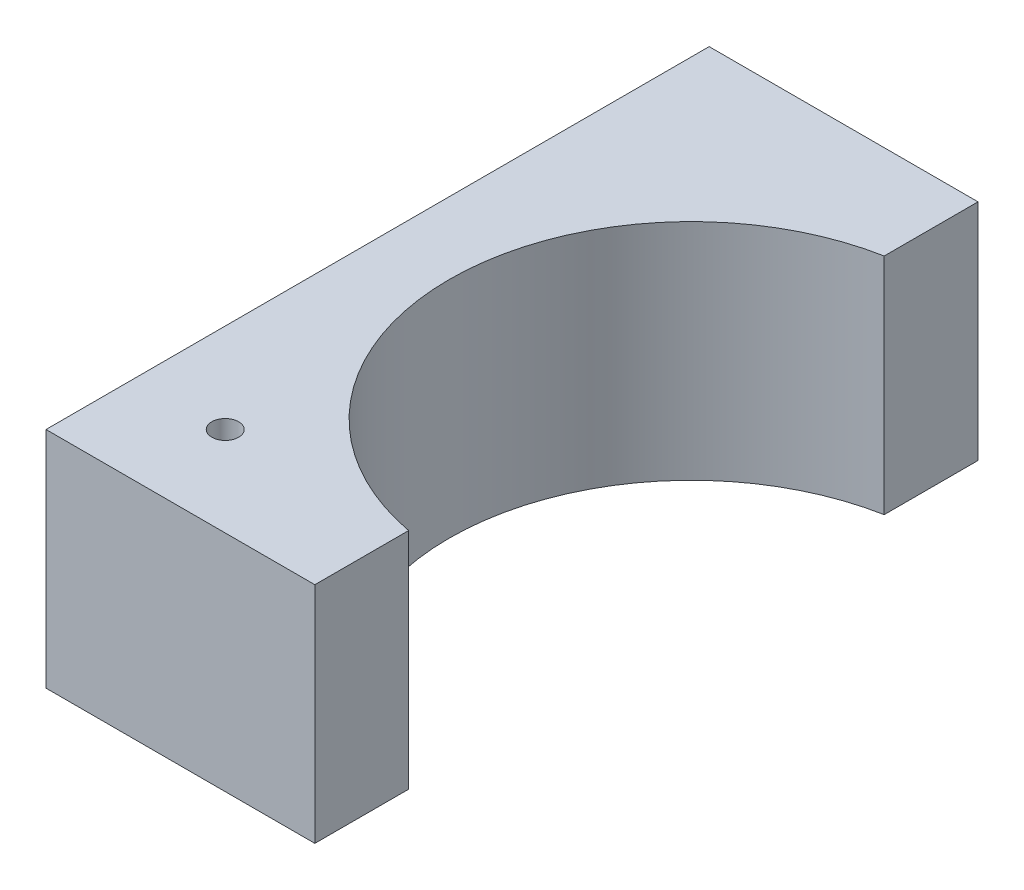
ISO-10303-21;
HEADER;
FILE_DESCRIPTION(('STEP AP214'),'2;1');
FILE_NAME('part.step','',(''),(''),'','','');
FILE_SCHEMA(('AUTOMOTIVE_DESIGN { 1 0 10303 214 1 1 1 1 }'));
ENDSEC;
DATA;
#1=APPLICATION_CONTEXT('core data for automotive mechanical design processes');
#2=APPLICATION_PROTOCOL_DEFINITION('international standard','automotive_design',2000,#1);
#3=PRODUCT_CONTEXT('',#1,'mechanical');
#4=PRODUCT('Part','Part','',(#3));
#5=PRODUCT_RELATED_PRODUCT_CATEGORY('part','',(#4));
#6=PRODUCT_DEFINITION_FORMATION('','',#4);
#7=PRODUCT_DEFINITION_CONTEXT('part definition',#1,'design');
#8=PRODUCT_DEFINITION('design','',#6,#7);
#9=PRODUCT_DEFINITION_SHAPE('','',#8);
#10=(LENGTH_UNIT() NAMED_UNIT(*) SI_UNIT(.MILLI.,.METRE.));
#11=(NAMED_UNIT(*) PLANE_ANGLE_UNIT() SI_UNIT($,.RADIAN.));
#12=(NAMED_UNIT(*) SI_UNIT($,.STERADIAN.) SOLID_ANGLE_UNIT());
#13=UNCERTAINTY_MEASURE_WITH_UNIT(LENGTH_MEASURE(1.E-05),#10,'distance_accuracy_value','');
#14=(GEOMETRIC_REPRESENTATION_CONTEXT(3) GLOBAL_UNCERTAINTY_ASSIGNED_CONTEXT((#13)) GLOBAL_UNIT_ASSIGNED_CONTEXT((#10,
#11,#12)) REPRESENTATION_CONTEXT('',''));
#15=CARTESIAN_POINT('',(0.,0.,0.));
#16=DIRECTION('',(0.,0.,1.));
#17=DIRECTION('',(1.,0.,0.));
#18=AXIS2_PLACEMENT_3D('',#15,#16,#17);
#19=CARTESIAN_POINT('',(70.,50.,-74.));
#20=DIRECTION('',(0.,1.,0.));
#21=DIRECTION('',(0.,0.,1.));
#22=AXIS2_PLACEMENT_3D('',#19,#20,#21);
#23=PLANE('',#22);
#24=DIRECTION('',(0.,0.,1.));
#25=VECTOR('',#24,1.);
#26=CARTESIAN_POINT('',(60.,50.,-148.));
#27=LINE('',#26,#25);
#28=CARTESIAN_POINT('',(60.,50.,-148.));
#29=VERTEX_POINT('',#28);
#30=CARTESIAN_POINT('',(60.,50.,-127.065996645686));
#31=VERTEX_POINT('',#30);
#32=EDGE_CURVE('E103',#29,#31,#27,.T.);
#33=ORIENTED_EDGE('',*,*,#32,.F.);
#34=DIRECTION('',(-1.,0.,0.));
#35=VECTOR('',#34,1.);
#36=CARTESIAN_POINT('',(0.,50.,-148.));
#37=LINE('',#36,#35);
#38=CARTESIAN_POINT('',(0.,50.,-148.));
#39=VERTEX_POINT('',#38);
#40=EDGE_CURVE('E121',#29,#39,#37,.T.);
#41=ORIENTED_EDGE('',*,*,#40,.T.);
#42=DIRECTION('',(0.,0.,1.));
#43=VECTOR('',#42,1.);
#44=CARTESIAN_POINT('',(0.,50.,0.));
#45=LINE('',#44,#43);
#46=CARTESIAN_POINT('',(0.,50.,0.));
#47=VERTEX_POINT('',#46);
#48=EDGE_CURVE('E115',#39,#47,#45,.T.);
#49=ORIENTED_EDGE('',*,*,#48,.T.);
#50=DIRECTION('',(1.,0.,0.));
#51=VECTOR('',#50,1.);
#52=CARTESIAN_POINT('',(70.,50.,0.));
#53=LINE('',#52,#51);
#54=CARTESIAN_POINT('',(60.,50.,0.));
#55=VERTEX_POINT('',#54);
#56=EDGE_CURVE('E120',#47,#55,#53,.T.);
#57=ORIENTED_EDGE('',*,*,#56,.T.);
#58=CARTESIAN_POINT('',(60.,50.,-20.9340033543136));
#59=VERTEX_POINT('',#58);
#60=EDGE_CURVE('E86',#59,#55,#27,.T.);
#61=ORIENTED_EDGE('',*,*,#60,.F.);
#62=CARTESIAN_POINT('',(70.,50.,-74.));
#63=DIRECTION('',(0.,-1.,0.));
#64=DIRECTION('',(0.,0.,1.));
#65=AXIS2_PLACEMENT_3D('',#62,#63,#64);
#66=CIRCLE('',#65,54.);
#67=EDGE_CURVE('E124',#59,#31,#66,.T.);
#68=ORIENTED_EDGE('',*,*,#67,.T.);
#69=EDGE_LOOP('',(#33,#41,#49,#57,#61,#68));
#70=FACE_BOUND('',#69,.T.);
#71=CARTESIAN_POINT('',(20.,50.,-20.));
#72=DIRECTION('',(0.,1.,0.));
#73=DIRECTION('',(0.,0.,1.));
#74=AXIS2_PLACEMENT_3D('',#71,#72,#73);
#75=CIRCLE('',#74,3.);
#76=CARTESIAN_POINT('',(20.,50.,-17.));
#77=VERTEX_POINT('',#76);
#78=EDGE_CURVE('E107',#77,#77,#75,.T.);
#79=ORIENTED_EDGE('',*,*,#78,.F.);
#80=EDGE_LOOP('',(#79));
#81=FACE_BOUND('',#80,.T.);
#82=ADVANCED_FACE('F32',(#70,#81),#23,.T.);
#83=CARTESIAN_POINT('',(70.,0.,-74.));
#84=DIRECTION('',(0.,1.,0.));
#85=DIRECTION('',(0.,0.,1.));
#86=AXIS2_PLACEMENT_3D('',#83,#84,#85);
#87=PLANE('',#86);
#88=DIRECTION('',(-1.,0.,0.));
#89=VECTOR('',#88,1.);
#90=CARTESIAN_POINT('',(0.,0.,-148.));
#91=LINE('',#90,#89);
#92=CARTESIAN_POINT('',(60.,0.,-148.));
#93=VERTEX_POINT('',#92);
#94=CARTESIAN_POINT('',(0.,0.,-148.));
#95=VERTEX_POINT('',#94);
#96=EDGE_CURVE('E109',#93,#95,#91,.T.);
#97=ORIENTED_EDGE('',*,*,#96,.F.);
#98=DIRECTION('',(0.,0.,1.));
#99=VECTOR('',#98,1.);
#100=CARTESIAN_POINT('',(60.,0.,-148.));
#101=LINE('',#100,#99);
#102=CARTESIAN_POINT('',(60.,0.,-127.065996645686));
#103=VERTEX_POINT('',#102);
#104=EDGE_CURVE('E55',#93,#103,#101,.T.);
#105=ORIENTED_EDGE('',*,*,#104,.T.);
#106=CARTESIAN_POINT('',(70.,0.,-74.));
#107=DIRECTION('',(0.,-1.,0.));
#108=DIRECTION('',(0.,0.,1.));
#109=AXIS2_PLACEMENT_3D('',#106,#107,#108);
#110=CIRCLE('',#109,54.);
#111=CARTESIAN_POINT('',(60.,0.,-20.9340033543136));
#112=VERTEX_POINT('',#111);
#113=EDGE_CURVE('E102',#112,#103,#110,.T.);
#114=ORIENTED_EDGE('',*,*,#113,.F.);
#115=CARTESIAN_POINT('',(60.,0.,0.));
#116=VERTEX_POINT('',#115);
#117=EDGE_CURVE('E47',#112,#116,#101,.T.);
#118=ORIENTED_EDGE('',*,*,#117,.T.);
#119=DIRECTION('',(1.,0.,0.));
#120=VECTOR('',#119,1.);
#121=CARTESIAN_POINT('',(70.,0.,0.));
#122=LINE('',#121,#120);
#123=CARTESIAN_POINT('',(0.,0.,0.));
#124=VERTEX_POINT('',#123);
#125=EDGE_CURVE('E100',#124,#116,#122,.T.);
#126=ORIENTED_EDGE('',*,*,#125,.F.);
#127=DIRECTION('',(0.,0.,1.));
#128=VECTOR('',#127,1.);
#129=CARTESIAN_POINT('',(0.,0.,0.));
#130=LINE('',#129,#128);
#131=EDGE_CURVE('E119',#95,#124,#130,.T.);
#132=ORIENTED_EDGE('',*,*,#131,.F.);
#133=EDGE_LOOP('',(#97,#105,#114,#118,#126,#132));
#134=FACE_BOUND('',#133,.T.);
#135=CARTESIAN_POINT('',(20.,0.,-20.));
#136=DIRECTION('',(0.,1.,0.));
#137=DIRECTION('',(0.,0.,1.));
#138=AXIS2_PLACEMENT_3D('',#135,#136,#137);
#139=CIRCLE('',#138,3.);
#140=CARTESIAN_POINT('',(20.,0.,-17.));
#141=VERTEX_POINT('',#140);
#142=EDGE_CURVE('E112',#141,#141,#139,.T.);
#143=ORIENTED_EDGE('',*,*,#142,.T.);
#144=EDGE_LOOP('',(#143));
#145=FACE_BOUND('',#144,.T.);
#146=ADVANCED_FACE('F97',(#134,#145),#87,.F.);
#147=CARTESIAN_POINT('',(70.,50.,0.));
#148=DIRECTION('',(0.,0.,-1.));
#149=DIRECTION('',(-1.,0.,0.));
#150=AXIS2_PLACEMENT_3D('',#147,#148,#149);
#151=PLANE('',#150);
#152=ORIENTED_EDGE('',*,*,#125,.T.);
#153=DIRECTION('',(0.,1.,0.));
#154=VECTOR('',#153,1.);
#155=CARTESIAN_POINT('',(60.,0.,0.));
#156=LINE('',#155,#154);
#157=EDGE_CURVE('E83',#116,#55,#156,.T.);
#158=ORIENTED_EDGE('',*,*,#157,.T.);
#159=ORIENTED_EDGE('',*,*,#56,.F.);
#160=DIRECTION('',(0.,-1.,0.));
#161=VECTOR('',#160,1.);
#162=CARTESIAN_POINT('',(0.,50.,0.));
#163=LINE('',#162,#161);
#164=EDGE_CURVE('E40',#47,#124,#163,.T.);
#165=ORIENTED_EDGE('',*,*,#164,.T.);
#166=EDGE_LOOP('',(#152,#158,#159,#165));
#167=FACE_BOUND('',#166,.T.);
#168=ADVANCED_FACE('F34',(#167),#151,.F.);
#169=CARTESIAN_POINT('',(70.,50.,-74.));
#170=DIRECTION('',(0.,-1.,0.));
#171=DIRECTION('',(0.,0.,-1.));
#172=AXIS2_PLACEMENT_3D('',#169,#170,#171);
#173=CYLINDRICAL_SURFACE('',#172,54.);
#174=ORIENTED_EDGE('',*,*,#113,.T.);
#175=DIRECTION('',(0.,-1.,0.));
#176=VECTOR('',#175,1.);
#177=CARTESIAN_POINT('',(60.,50.,-127.065996645686));
#178=LINE('',#177,#176);
#179=EDGE_CURVE('E133',#103,#31,#178,.F.);
#180=ORIENTED_EDGE('',*,*,#179,.T.);
#181=ORIENTED_EDGE('',*,*,#67,.F.);
#182=DIRECTION('',(0.,-1.,0.));
#183=VECTOR('',#182,1.);
#184=CARTESIAN_POINT('',(60.,50.,-20.9340033543136));
#185=LINE('',#184,#183);
#186=EDGE_CURVE('E137',#59,#112,#185,.T.);
#187=ORIENTED_EDGE('',*,*,#186,.T.);
#188=EDGE_LOOP('',(#174,#180,#181,#187));
#189=FACE_BOUND('',#188,.T.);
#190=ADVANCED_FACE('F141',(#189),#173,.F.);
#191=CARTESIAN_POINT('',(0.,50.,-148.));
#192=DIRECTION('',(0.,0.,1.));
#193=DIRECTION('',(1.,0.,0.));
#194=AXIS2_PLACEMENT_3D('',#191,#192,#193);
#195=PLANE('',#194);
#196=ORIENTED_EDGE('',*,*,#40,.F.);
#197=DIRECTION('',(0.,1.,0.));
#198=VECTOR('',#197,1.);
#199=CARTESIAN_POINT('',(60.,0.,-148.));
#200=LINE('',#199,#198);
#201=EDGE_CURVE('E91',#93,#29,#200,.T.);
#202=ORIENTED_EDGE('',*,*,#201,.F.);
#203=ORIENTED_EDGE('',*,*,#96,.T.);
#204=DIRECTION('',(0.,-1.,0.));
#205=VECTOR('',#204,1.);
#206=CARTESIAN_POINT('',(0.,50.,-148.));
#207=LINE('',#206,#205);
#208=EDGE_CURVE('E11',#39,#95,#207,.T.);
#209=ORIENTED_EDGE('',*,*,#208,.F.);
#210=EDGE_LOOP('',(#196,#202,#203,#209));
#211=FACE_BOUND('',#210,.T.);
#212=ADVANCED_FACE('F145',(#211),#195,.F.);
#213=CARTESIAN_POINT('',(0.,50.,0.));
#214=DIRECTION('',(1.,0.,0.));
#215=DIRECTION('',(0.,0.,-1.));
#216=AXIS2_PLACEMENT_3D('',#213,#214,#215);
#217=PLANE('',#216);
#218=ORIENTED_EDGE('',*,*,#131,.T.);
#219=ORIENTED_EDGE('',*,*,#164,.F.);
#220=ORIENTED_EDGE('',*,*,#48,.F.);
#221=ORIENTED_EDGE('',*,*,#208,.T.);
#222=EDGE_LOOP('',(#218,#219,#220,#221));
#223=FACE_BOUND('',#222,.T.);
#224=ADVANCED_FACE('F147',(#223),#217,.F.);
#225=CARTESIAN_POINT('',(20.,50.,-20.));
#226=DIRECTION('',(0.,-1.,0.));
#227=DIRECTION('',(0.,0.,-1.));
#228=AXIS2_PLACEMENT_3D('',#225,#226,#227);
#229=CYLINDRICAL_SURFACE('',#228,3.);
#230=ORIENTED_EDGE('',*,*,#78,.T.);
#231=EDGE_LOOP('',(#230));
#232=FACE_BOUND('',#231,.T.);
#233=ORIENTED_EDGE('',*,*,#142,.F.);
#234=EDGE_LOOP('',(#233));
#235=FACE_BOUND('',#234,.T.);
#236=ADVANCED_FACE('F149',(#232,#235),#229,.F.);
#237=CARTESIAN_POINT('',(60.,0.,-148.));
#238=DIRECTION('',(-1.,0.,0.));
#239=DIRECTION('',(0.,0.,1.));
#240=AXIS2_PLACEMENT_3D('',#237,#238,#239);
#241=PLANE('',#240);
#242=ORIENTED_EDGE('',*,*,#104,.F.);
#243=ORIENTED_EDGE('',*,*,#201,.T.);
#244=ORIENTED_EDGE('',*,*,#32,.T.);
#245=ORIENTED_EDGE('',*,*,#179,.F.);
#246=EDGE_LOOP('',(#242,#243,#244,#245));
#247=FACE_BOUND('',#246,.T.);
#248=ADVANCED_FACE('F155',(#247),#241,.F.);
#249=ORIENTED_EDGE('',*,*,#60,.T.);
#250=ORIENTED_EDGE('',*,*,#157,.F.);
#251=ORIENTED_EDGE('',*,*,#117,.F.);
#252=ORIENTED_EDGE('',*,*,#186,.F.);
#253=EDGE_LOOP('',(#249,#250,#251,#252));
#254=FACE_BOUND('',#253,.T.);
#255=ADVANCED_FACE('F84',(#254),#241,.F.);
#256=CLOSED_SHELL('',(#82,#146,#168,#190,#212,#224,#236,#248,#255));
#257=MANIFOLD_SOLID_BREP('B2',#256);
#258=ADVANCED_BREP_SHAPE_REPRESENTATION('',(#18,#257),#14);
#259=SHAPE_DEFINITION_REPRESENTATION(#9,#258);
ENDSEC;
END-ISO-10303-21;
